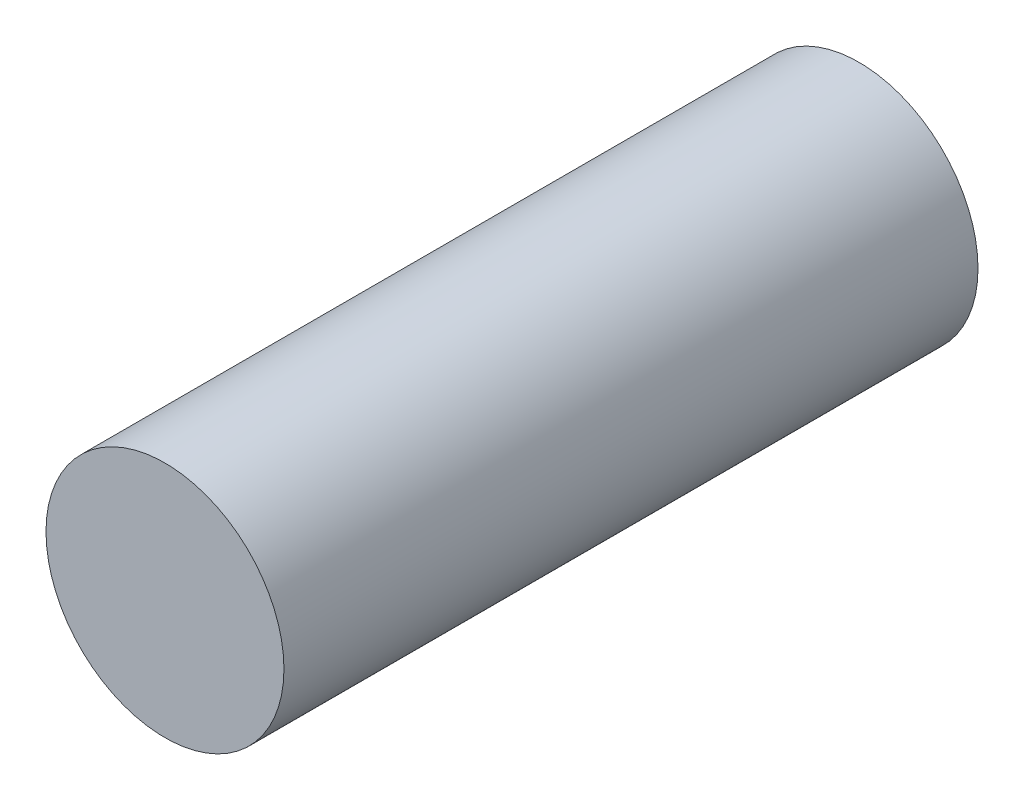
ISO-10303-21;
HEADER;
FILE_DESCRIPTION(('STEP AP214'),'2;1');
FILE_NAME('part.step','',(''),(''),'','','');
FILE_SCHEMA(('AUTOMOTIVE_DESIGN { 1 0 10303 214 1 1 1 1 }'));
ENDSEC;
DATA;
#1=APPLICATION_CONTEXT('core data for automotive mechanical design processes');
#2=APPLICATION_PROTOCOL_DEFINITION('international standard','automotive_design',2000,#1);
#3=PRODUCT_CONTEXT('',#1,'mechanical');
#4=PRODUCT('Part','Part','',(#3));
#5=PRODUCT_RELATED_PRODUCT_CATEGORY('part','',(#4));
#6=PRODUCT_DEFINITION_FORMATION('','',#4);
#7=PRODUCT_DEFINITION_CONTEXT('part definition',#1,'design');
#8=PRODUCT_DEFINITION('design','',#6,#7);
#9=PRODUCT_DEFINITION_SHAPE('','',#8);
#10=(LENGTH_UNIT() NAMED_UNIT(*) SI_UNIT(.MILLI.,.METRE.));
#11=(NAMED_UNIT(*) PLANE_ANGLE_UNIT() SI_UNIT($,.RADIAN.));
#12=(NAMED_UNIT(*) SI_UNIT($,.STERADIAN.) SOLID_ANGLE_UNIT());
#13=UNCERTAINTY_MEASURE_WITH_UNIT(LENGTH_MEASURE(1.E-05),#10,'distance_accuracy_value','');
#14=(GEOMETRIC_REPRESENTATION_CONTEXT(3) GLOBAL_UNCERTAINTY_ASSIGNED_CONTEXT((#13)) GLOBAL_UNIT_ASSIGNED_CONTEXT((#10,
#11,#12)) REPRESENTATION_CONTEXT('',''));
#15=CARTESIAN_POINT('',(0.,0.,0.));
#16=DIRECTION('',(0.,0.,1.));
#17=DIRECTION('',(1.,0.,0.));
#18=AXIS2_PLACEMENT_3D('',#15,#16,#17);
#19=CARTESIAN_POINT('',(0.,0.,175.));
#20=DIRECTION('',(0.,0.,-1.));
#21=DIRECTION('',(-1.,0.,0.));
#22=AXIS2_PLACEMENT_3D('',#19,#20,#21);
#23=CYLINDRICAL_SURFACE('',#22,30.);
#24=CARTESIAN_POINT('',(0.,0.,175.));
#25=DIRECTION('',(0.,0.,1.));
#26=DIRECTION('',(1.,0.,0.));
#27=AXIS2_PLACEMENT_3D('',#24,#25,#26);
#28=CIRCLE('',#27,30.);
#29=CARTESIAN_POINT('',(30.,0.,175.));
#30=VERTEX_POINT('',#29);
#31=EDGE_CURVE('E10',#30,#30,#28,.T.);
#32=ORIENTED_EDGE('',*,*,#31,.F.);
#33=EDGE_LOOP('',(#32));
#34=FACE_BOUND('',#33,.T.);
#35=CARTESIAN_POINT('',(0.,0.,0.));
#36=DIRECTION('',(0.,0.,1.));
#37=DIRECTION('',(1.,0.,0.));
#38=AXIS2_PLACEMENT_3D('',#35,#36,#37);
#39=CIRCLE('',#38,30.);
#40=CARTESIAN_POINT('',(30.,0.,0.));
#41=VERTEX_POINT('',#40);
#42=EDGE_CURVE('E40',#41,#41,#39,.T.);
#43=ORIENTED_EDGE('',*,*,#42,.T.);
#44=EDGE_LOOP('',(#43));
#45=FACE_BOUND('',#44,.T.);
#46=ADVANCED_FACE('F37',(#34,#45),#23,.T.);
#47=CARTESIAN_POINT('',(0.,0.,175.));
#48=DIRECTION('',(0.,0.,1.));
#49=DIRECTION('',(1.,0.,0.));
#50=AXIS2_PLACEMENT_3D('',#47,#48,#49);
#51=PLANE('',#50);
#52=ORIENTED_EDGE('',*,*,#31,.T.);
#53=EDGE_LOOP('',(#52));
#54=FACE_BOUND('',#53,.T.);
#55=ADVANCED_FACE('F54',(#54),#51,.T.);
#56=CARTESIAN_POINT('',(0.,0.,0.));
#57=DIRECTION('',(0.,0.,1.));
#58=DIRECTION('',(1.,0.,0.));
#59=AXIS2_PLACEMENT_3D('',#56,#57,#58);
#60=PLANE('',#59);
#61=ORIENTED_EDGE('',*,*,#42,.F.);
#62=EDGE_LOOP('',(#61));
#63=FACE_BOUND('',#62,.T.);
#64=ADVANCED_FACE('F52',(#63),#60,.F.);
#65=CLOSED_SHELL('',(#46,#55,#64));
#66=MANIFOLD_SOLID_BREP('B2',#65);
#67=ADVANCED_BREP_SHAPE_REPRESENTATION('',(#18,#66),#14);
#68=SHAPE_DEFINITION_REPRESENTATION(#9,#67);
ENDSEC;
END-ISO-10303-21;
